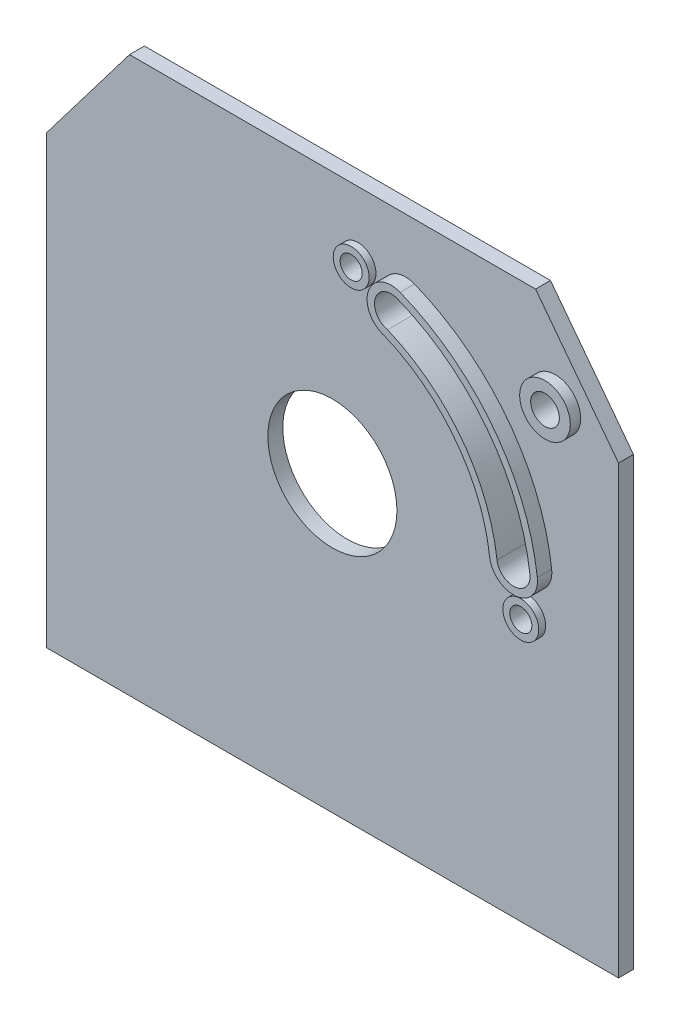
ISO-10303-21;
HEADER;
FILE_DESCRIPTION(('STEP AP214'),'2;1');
FILE_NAME('part.step','',(''),(''),'','','');
FILE_SCHEMA(('AUTOMOTIVE_DESIGN { 1 0 10303 214 1 1 1 1 }'));
ENDSEC;
DATA;
#1=APPLICATION_CONTEXT('core data for automotive mechanical design processes');
#2=APPLICATION_PROTOCOL_DEFINITION('international standard','automotive_design',2000,#1);
#3=PRODUCT_CONTEXT('',#1,'mechanical');
#4=PRODUCT('Part','Part','',(#3));
#5=PRODUCT_RELATED_PRODUCT_CATEGORY('part','',(#4));
#6=PRODUCT_DEFINITION_FORMATION('','',#4);
#7=PRODUCT_DEFINITION_CONTEXT('part definition',#1,'design');
#8=PRODUCT_DEFINITION('design','',#6,#7);
#9=PRODUCT_DEFINITION_SHAPE('','',#8);
#10=(LENGTH_UNIT() NAMED_UNIT(*) SI_UNIT(.MILLI.,.METRE.));
#11=(NAMED_UNIT(*) PLANE_ANGLE_UNIT() SI_UNIT($,.RADIAN.));
#12=(NAMED_UNIT(*) SI_UNIT($,.STERADIAN.) SOLID_ANGLE_UNIT());
#13=UNCERTAINTY_MEASURE_WITH_UNIT(LENGTH_MEASURE(1.E-05),#10,'distance_accuracy_value','');
#14=(GEOMETRIC_REPRESENTATION_CONTEXT(3) GLOBAL_UNCERTAINTY_ASSIGNED_CONTEXT((#13)) GLOBAL_UNIT_ASSIGNED_CONTEXT((#10,
#11,#12)) REPRESENTATION_CONTEXT('',''));
#15=CARTESIAN_POINT('',(0.,0.,0.));
#16=DIRECTION('',(0.,0.,1.));
#17=DIRECTION('',(1.,0.,0.));
#18=AXIS2_PLACEMENT_3D('',#15,#16,#17);
#19=CARTESIAN_POINT('',(-4.53865850270509,103.090232189093,3.302));
#20=DIRECTION('',(0.,0.,-1.));
#21=DIRECTION('',(-1.,0.,0.));
#22=AXIS2_PLACEMENT_3D('',#19,#20,#21);
#23=PLANE('',#22);
#24=CARTESIAN_POINT('',(101.914361119273,39.6877037000921,3.302));
#25=DIRECTION('',(0.,0.,-1.));
#26=DIRECTION('',(-1.,0.,0.));
#27=AXIS2_PLACEMENT_3D('',#24,#25,#26);
#28=CIRCLE('',#27,3.9699438135045);
#29=CARTESIAN_POINT('',(97.9444173057683,39.6877037000921,3.302));
#30=VERTEX_POINT('',#29);
#31=EDGE_CURVE('E39',#30,#30,#28,.F.);
#32=ORIENTED_EDGE('',*,*,#31,.F.);
#33=EDGE_LOOP('',(#32));
#34=FACE_BOUND('',#33,.T.);
#35=CARTESIAN_POINT('',(101.948212365503,50.5338067103253,3.302));
#36=DIRECTION('',(0.,0.,1.));
#37=DIRECTION('',(1.,0.,0.));
#38=AXIS2_PLACEMENT_3D('',#35,#36,#37);
#39=CIRCLE('',#38,5.31484677941774);
#40=CARTESIAN_POINT('',(96.6726249980341,49.8889996987221,3.302));
#41=VERTEX_POINT('',#40);
#42=CARTESIAN_POINT('',(107.223783387203,51.1787464933555,3.302));
#43=VERTEX_POINT('',#42);
#44=EDGE_CURVE('E162',#41,#43,#39,.T.);
#45=ORIENTED_EDGE('',*,*,#44,.F.);
#46=CARTESIAN_POINT('',(58.7102499448752,45.2839103709194,3.302));
#47=DIRECTION('',(0.,0.,-1.));
#48=DIRECTION('',(1.,0.,0.));
#49=AXIS2_PLACEMENT_3D('',#46,#47,#48);
#50=CIRCLE('',#49,38.2406690238775);
#51=CARTESIAN_POINT('',(73.552104790075,80.5268970795932,3.302));
#52=VERTEX_POINT('',#51);
#53=EDGE_CURVE('E167',#52,#41,#50,.T.);
#54=ORIENTED_EDGE('',*,*,#53,.F.);
#55=CARTESIAN_POINT('',(74.8906557668307,85.6959061029263,3.302));
#56=DIRECTION('',(0.,0.,1.));
#57=DIRECTION('',(1.,0.,0.));
#58=AXIS2_PLACEMENT_3D('',#55,#56,#57);
#59=CIRCLE('',#58,5.33951065483602);
#60=CARTESIAN_POINT('',(76.8713576571716,90.6544536780441,3.302));
#61=VERTEX_POINT('',#60);
#62=EDGE_CURVE('E51',#61,#52,#59,.T.);
#63=ORIENTED_EDGE('',*,*,#62,.F.);
#64=CARTESIAN_POINT('',(58.7102499448752,45.2839103709194,3.302));
#65=DIRECTION('',(0.,0.,1.));
#66=DIRECTION('',(1.,0.,0.));
#67=AXIS2_PLACEMENT_3D('',#64,#65,#66);
#68=CIRCLE('',#67,48.8703593190208);
#69=EDGE_CURVE('E46',#43,#61,#68,.T.);
#70=ORIENTED_EDGE('',*,*,#69,.F.);
#71=EDGE_LOOP('',(#45,#54,#63,#70));
#72=FACE_BOUND('',#71,.T.);
#73=CARTESIAN_POINT('',(58.7102499448752,45.2839103709194,3.302));
#74=DIRECTION('',(0.,0.,1.));
#75=DIRECTION('',(1.,0.,0.));
#76=AXIS2_PLACEMENT_3D('',#73,#74,#75);
#77=CIRCLE('',#76,14.2801546214257);
#78=CARTESIAN_POINT('',(72.9904045663009,45.2839103709194,3.302));
#79=VERTEX_POINT('',#78);
#80=EDGE_CURVE('E209',#79,#79,#77,.T.);
#81=ORIENTED_EDGE('',*,*,#80,.F.);
#82=EDGE_LOOP('',(#81));
#83=FACE_BOUND('',#82,.T.);
#84=DIRECTION('',(0.,-1.,0.));
#85=VECTOR('',#84,1.);
#86=CARTESIAN_POINT('',(-4.5386585027051,-19.7472607340086,3.302));
#87=LINE('',#86,#85);
#88=CARTESIAN_POINT('',(-4.5386585027051,78.9321762768436,3.302));
#89=VERTEX_POINT('',#88);
#90=CARTESIAN_POINT('',(-4.5386585027051,-19.7472607340086,3.302));
#91=VERTEX_POINT('',#90);
#92=EDGE_CURVE('E218',#89,#91,#87,.T.);
#93=ORIENTED_EDGE('',*,*,#92,.T.);
#94=DIRECTION('',(1.,0.,0.));
#95=VECTOR('',#94,1.);
#96=CARTESIAN_POINT('',(-4.5386585027051,-19.7472607340086,3.302));
#97=LINE('',#96,#95);
#98=CARTESIAN_POINT('',(122.018241697402,-19.7472607340086,3.302));
#99=VERTEX_POINT('',#98);
#100=EDGE_CURVE('E221',#91,#99,#97,.T.);
#101=ORIENTED_EDGE('',*,*,#100,.T.);
#102=DIRECTION('',(0.,1.,0.));
#103=VECTOR('',#102,1.);
#104=CARTESIAN_POINT('',(122.018241697402,-19.7472607340086,3.302));
#105=LINE('',#104,#103);
#106=CARTESIAN_POINT('',(122.018241697402,78.9321762768436,3.302));
#107=VERTEX_POINT('',#106);
#108=EDGE_CURVE('E224',#99,#107,#105,.T.);
#109=ORIENTED_EDGE('',*,*,#108,.T.);
#110=DIRECTION('',(-0.604936983131272,0.796273349070553,0.));
#111=VECTOR('',#110,1.);
#112=CARTESIAN_POINT('',(122.018241697402,78.9321762768436,3.302));
#113=LINE('',#112,#111);
#114=CARTESIAN_POINT('',(103.665120273797,103.090232189093,3.302));
#115=VERTEX_POINT('',#114);
#116=EDGE_CURVE('E226',#107,#115,#113,.T.);
#117=ORIENTED_EDGE('',*,*,#116,.T.);
#118=DIRECTION('',(-1.,0.,0.));
#119=VECTOR('',#118,1.);
#120=CARTESIAN_POINT('',(13.8144629209003,103.090232189093,3.302));
#121=LINE('',#120,#119);
#122=CARTESIAN_POINT('',(13.8144629209003,103.090232189093,3.302));
#123=VERTEX_POINT('',#122);
#124=EDGE_CURVE('E228',#115,#123,#121,.T.);
#125=ORIENTED_EDGE('',*,*,#124,.T.);
#126=DIRECTION('',(-0.604936983131272,-0.796273349070553,0.));
#127=VECTOR('',#126,1.);
#128=CARTESIAN_POINT('',(-4.5386585027051,78.9321762768436,3.302));
#129=LINE('',#128,#127);
#130=EDGE_CURVE('E230',#123,#89,#129,.T.);
#131=ORIENTED_EDGE('',*,*,#130,.T.);
#132=EDGE_LOOP('',(#93,#101,#109,#117,#125,#131));
#133=FACE_BOUND('',#132,.T.);
#134=CARTESIAN_POINT('',(64.386022104351,88.408658992849,3.302));
#135=DIRECTION('',(0.,0.,-1.));
#136=DIRECTION('',(-1.,0.,0.));
#137=AXIS2_PLACEMENT_3D('',#134,#135,#136);
#138=CIRCLE('',#137,3.96994381350452);
#139=CARTESIAN_POINT('',(60.4160782908465,88.408658992849,3.302));
#140=VERTEX_POINT('',#139);
#141=EDGE_CURVE('E261',#140,#140,#138,.F.);
#142=ORIENTED_EDGE('',*,*,#141,.F.);
#143=EDGE_LOOP('',(#142));
#144=FACE_BOUND('',#143,.T.);
#145=CARTESIAN_POINT('',(108.031447678437,83.2745987317091,3.302));
#146=DIRECTION('',(0.,0.,-1.));
#147=DIRECTION('',(-1.,0.,0.));
#148=AXIS2_PLACEMENT_3D('',#145,#146,#147);
#149=CIRCLE('',#148,5.6045816291887);
#150=CARTESIAN_POINT('',(102.426866049248,83.2745987317091,3.302));
#151=VERTEX_POINT('',#150);
#152=EDGE_CURVE('E11',#151,#151,#149,.F.);
#153=ORIENTED_EDGE('',*,*,#152,.F.);
#154=EDGE_LOOP('',(#153));
#155=FACE_BOUND('',#154,.T.);
#156=ADVANCED_FACE('F31',(#34,#72,#83,#133,#144,#155),#23,.F.);
#157=CARTESIAN_POINT('',(-4.53865850270509,103.090232189093,0.));
#158=DIRECTION('',(0.,0.,-1.));
#159=DIRECTION('',(-1.,0.,0.));
#160=AXIS2_PLACEMENT_3D('',#157,#158,#159);
#161=PLANE('',#160);
#162=CARTESIAN_POINT('',(64.386022104351,88.408658992849,0.));
#163=DIRECTION('',(0.,0.,1.));
#164=DIRECTION('',(1.,0.,0.));
#165=AXIS2_PLACEMENT_3D('',#162,#163,#164);
#166=CIRCLE('',#165,2.44594381350452);
#167=CARTESIAN_POINT('',(66.8319659178556,88.408658992849,0.));
#168=VERTEX_POINT('',#167);
#169=EDGE_CURVE('E193',#168,#168,#166,.T.);
#170=ORIENTED_EDGE('',*,*,#169,.T.);
#171=EDGE_LOOP('',(#170));
#172=FACE_BOUND('',#171,.T.);
#173=CARTESIAN_POINT('',(58.7102499448752,45.2839103709194,0.));
#174=DIRECTION('',(0.,0.,1.));
#175=DIRECTION('',(1.,0.,0.));
#176=AXIS2_PLACEMENT_3D('',#173,#174,#175);
#177=CIRCLE('',#176,14.2801546214257);
#178=CARTESIAN_POINT('',(72.9904045663009,45.2839103709194,0.));
#179=VERTEX_POINT('',#178);
#180=EDGE_CURVE('E140',#179,#179,#177,.T.);
#181=ORIENTED_EDGE('',*,*,#180,.T.);
#182=EDGE_LOOP('',(#181));
#183=FACE_BOUND('',#182,.T.);
#184=DIRECTION('',(0.,-1.,0.));
#185=VECTOR('',#184,1.);
#186=CARTESIAN_POINT('',(-4.5386585027051,-19.7472607340086,0.));
#187=LINE('',#186,#185);
#188=CARTESIAN_POINT('',(-4.5386585027051,78.9321762768436,0.));
#189=VERTEX_POINT('',#188);
#190=CARTESIAN_POINT('',(-4.5386585027051,-19.7472607340086,0.));
#191=VERTEX_POINT('',#190);
#192=EDGE_CURVE('E217',#189,#191,#187,.T.);
#193=ORIENTED_EDGE('',*,*,#192,.F.);
#194=DIRECTION('',(-0.604936983131272,-0.796273349070553,0.));
#195=VECTOR('',#194,1.);
#196=CARTESIAN_POINT('',(-4.5386585027051,78.9321762768436,0.));
#197=LINE('',#196,#195);
#198=CARTESIAN_POINT('',(13.8144629209003,103.090232189093,0.));
#199=VERTEX_POINT('',#198);
#200=EDGE_CURVE('E222',#199,#189,#197,.T.);
#201=ORIENTED_EDGE('',*,*,#200,.F.);
#202=DIRECTION('',(-1.,0.,0.));
#203=VECTOR('',#202,1.);
#204=CARTESIAN_POINT('',(13.8144629209003,103.090232189093,0.));
#205=LINE('',#204,#203);
#206=CARTESIAN_POINT('',(103.665120273797,103.090232189093,0.));
#207=VERTEX_POINT('',#206);
#208=EDGE_CURVE('E241',#207,#199,#205,.T.);
#209=ORIENTED_EDGE('',*,*,#208,.F.);
#210=DIRECTION('',(-0.604936983131272,0.796273349070553,0.));
#211=VECTOR('',#210,1.);
#212=CARTESIAN_POINT('',(122.018241697402,78.9321762768436,0.));
#213=LINE('',#212,#211);
#214=CARTESIAN_POINT('',(122.018241697402,78.9321762768436,0.));
#215=VERTEX_POINT('',#214);
#216=EDGE_CURVE('E239',#215,#207,#213,.T.);
#217=ORIENTED_EDGE('',*,*,#216,.F.);
#218=DIRECTION('',(0.,1.,0.));
#219=VECTOR('',#218,1.);
#220=CARTESIAN_POINT('',(122.018241697402,-19.7472607340086,0.));
#221=LINE('',#220,#219);
#222=CARTESIAN_POINT('',(122.018241697402,-19.7472607340086,0.));
#223=VERTEX_POINT('',#222);
#224=EDGE_CURVE('E237',#223,#215,#221,.T.);
#225=ORIENTED_EDGE('',*,*,#224,.F.);
#226=DIRECTION('',(1.,0.,0.));
#227=VECTOR('',#226,1.);
#228=CARTESIAN_POINT('',(-4.5386585027051,-19.7472607340086,0.));
#229=LINE('',#228,#227);
#230=EDGE_CURVE('E235',#191,#223,#229,.T.);
#231=ORIENTED_EDGE('',*,*,#230,.F.);
#232=EDGE_LOOP('',(#193,#201,#209,#217,#225,#231));
#233=FACE_BOUND('',#232,.T.);
#234=CARTESIAN_POINT('',(108.031447678437,83.2745987317091,0.));
#235=DIRECTION('',(0.,0.,1.));
#236=DIRECTION('',(1.,0.,0.));
#237=AXIS2_PLACEMENT_3D('',#234,#235,#236);
#238=CIRCLE('',#237,3.175);
#239=CARTESIAN_POINT('',(111.206447678437,83.2745987317091,0.));
#240=VERTEX_POINT('',#239);
#241=EDGE_CURVE('E212',#240,#240,#238,.T.);
#242=ORIENTED_EDGE('',*,*,#241,.T.);
#243=EDGE_LOOP('',(#242));
#244=FACE_BOUND('',#243,.T.);
#245=CARTESIAN_POINT('',(74.8906557668307,85.6959061029263,0.));
#246=DIRECTION('',(0.,0.,1.));
#247=DIRECTION('',(1.,0.,0.));
#248=AXIS2_PLACEMENT_3D('',#245,#246,#247);
#249=CIRCLE('',#248,3.68851078564109);
#250=CARTESIAN_POINT('',(76.2584574883382,89.1214323787606,0.));
#251=VERTEX_POINT('',#250);
#252=CARTESIAN_POINT('',(74.070723533951,82.0996826742061,0.));
#253=VERTEX_POINT('',#252);
#254=EDGE_CURVE('E202',#251,#253,#249,.T.);
#255=ORIENTED_EDGE('',*,*,#254,.T.);
#256=CARTESIAN_POINT('',(58.7102499448752,45.2839103709194,0.));
#257=DIRECTION('',(0.,0.,-1.));
#258=DIRECTION('',(1.,0.,0.));
#259=AXIS2_PLACEMENT_3D('',#256,#257,#258);
#260=CIRCLE('',#259,39.8916687939744);
#261=CARTESIAN_POINT('',(98.31150142406,50.0887121827027,0.));
#262=VERTEX_POINT('',#261);
#263=EDGE_CURVE('E196',#253,#262,#260,.T.);
#264=ORIENTED_EDGE('',*,*,#263,.T.);
#265=CARTESIAN_POINT('',(101.948212365503,50.5338067103253,0.));
#266=DIRECTION('',(0.,0.,1.));
#267=DIRECTION('',(1.,0.,0.));
#268=AXIS2_PLACEMENT_3D('',#265,#266,#267);
#269=CIRCLE('',#268,3.66384710517959);
#270=CARTESIAN_POINT('',(105.584923306947,50.9789012379478,0.));
#271=VERTEX_POINT('',#270);
#272=EDGE_CURVE('E137',#262,#271,#269,.T.);
#273=ORIENTED_EDGE('',*,*,#272,.T.);
#274=CARTESIAN_POINT('',(58.7102499448752,45.2839103709194,0.));
#275=DIRECTION('',(0.,0.,1.));
#276=DIRECTION('',(1.,0.,0.));
#277=AXIS2_PLACEMENT_3D('',#274,#275,#276);
#278=CIRCLE('',#277,47.2193596290379);
#279=EDGE_CURVE('E199',#271,#251,#278,.T.);
#280=ORIENTED_EDGE('',*,*,#279,.T.);
#281=EDGE_LOOP('',(#255,#264,#273,#280));
#282=FACE_BOUND('',#281,.T.);
#283=CARTESIAN_POINT('',(101.914361119273,39.6877037000921,0.));
#284=DIRECTION('',(0.,0.,1.));
#285=DIRECTION('',(-1.,0.,0.));
#286=AXIS2_PLACEMENT_3D('',#283,#284,#285);
#287=CIRCLE('',#286,2.44594381350451);
#288=CARTESIAN_POINT('',(99.4684173057683,39.6877037000921,0.));
#289=VERTEX_POINT('',#288);
#290=EDGE_CURVE('E190',#289,#289,#287,.T.);
#291=ORIENTED_EDGE('',*,*,#290,.T.);
#292=EDGE_LOOP('',(#291));
#293=FACE_BOUND('',#292,.T.);
#294=ADVANCED_FACE('F269',(#172,#183,#233,#244,#282,#293),#161,.T.);
#295=CARTESIAN_POINT('',(-4.5386585027051,-19.7472607340086,3.302));
#296=DIRECTION('',(1.,0.,0.));
#297=DIRECTION('',(0.,0.,-1.));
#298=AXIS2_PLACEMENT_3D('',#295,#296,#297);
#299=PLANE('',#298);
#300=ORIENTED_EDGE('',*,*,#192,.T.);
#301=DIRECTION('',(0.,0.,-1.));
#302=VECTOR('',#301,1.);
#303=CARTESIAN_POINT('',(-4.5386585027051,-19.7472607340086,3.302));
#304=LINE('',#303,#302);
#305=EDGE_CURVE('E258',#91,#191,#304,.T.);
#306=ORIENTED_EDGE('',*,*,#305,.F.);
#307=ORIENTED_EDGE('',*,*,#92,.F.);
#308=DIRECTION('',(0.,0.,-1.));
#309=VECTOR('',#308,1.);
#310=CARTESIAN_POINT('',(-4.5386585027051,78.9321762768436,3.302));
#311=LINE('',#310,#309);
#312=EDGE_CURVE('E232',#89,#189,#311,.T.);
#313=ORIENTED_EDGE('',*,*,#312,.T.);
#314=EDGE_LOOP('',(#300,#306,#307,#313));
#315=FACE_BOUND('',#314,.T.);
#316=ADVANCED_FACE('F33',(#315),#299,.F.);
#317=CARTESIAN_POINT('',(-4.5386585027051,-19.7472607340086,3.302));
#318=DIRECTION('',(0.,1.,0.));
#319=DIRECTION('',(0.,0.,1.));
#320=AXIS2_PLACEMENT_3D('',#317,#318,#319);
#321=PLANE('',#320);
#322=ORIENTED_EDGE('',*,*,#230,.T.);
#323=DIRECTION('',(0.,0.,-1.));
#324=VECTOR('',#323,1.);
#325=CARTESIAN_POINT('',(122.018241697402,-19.7472607340086,3.302));
#326=LINE('',#325,#324);
#327=EDGE_CURVE('E255',#99,#223,#326,.T.);
#328=ORIENTED_EDGE('',*,*,#327,.F.);
#329=ORIENTED_EDGE('',*,*,#100,.F.);
#330=ORIENTED_EDGE('',*,*,#305,.T.);
#331=EDGE_LOOP('',(#322,#328,#329,#330));
#332=FACE_BOUND('',#331,.T.);
#333=ADVANCED_FACE('F372',(#332),#321,.F.);
#334=CARTESIAN_POINT('',(122.018241697402,-19.7472607340086,3.302));
#335=DIRECTION('',(-1.,0.,0.));
#336=DIRECTION('',(0.,0.,1.));
#337=AXIS2_PLACEMENT_3D('',#334,#335,#336);
#338=PLANE('',#337);
#339=ORIENTED_EDGE('',*,*,#224,.T.);
#340=DIRECTION('',(0.,0.,-1.));
#341=VECTOR('',#340,1.);
#342=CARTESIAN_POINT('',(122.018241697402,78.9321762768436,3.302));
#343=LINE('',#342,#341);
#344=EDGE_CURVE('E252',#107,#215,#343,.T.);
#345=ORIENTED_EDGE('',*,*,#344,.F.);
#346=ORIENTED_EDGE('',*,*,#108,.F.);
#347=ORIENTED_EDGE('',*,*,#327,.T.);
#348=EDGE_LOOP('',(#339,#345,#346,#347));
#349=FACE_BOUND('',#348,.T.);
#350=ADVANCED_FACE('F369',(#349),#338,.F.);
#351=CARTESIAN_POINT('',(122.018241697402,78.9321762768436,3.302));
#352=DIRECTION('',(-0.796273349070553,-0.604936983131273,0.));
#353=DIRECTION('',(0.604936983131273,-0.796273349070553,0.));
#354=AXIS2_PLACEMENT_3D('',#351,#352,#353);
#355=PLANE('',#354);
#356=ORIENTED_EDGE('',*,*,#216,.T.);
#357=DIRECTION('',(0.,0.,-1.));
#358=VECTOR('',#357,1.);
#359=CARTESIAN_POINT('',(103.665120273797,103.090232189093,3.302));
#360=LINE('',#359,#358);
#361=EDGE_CURVE('E249',#115,#207,#360,.T.);
#362=ORIENTED_EDGE('',*,*,#361,.F.);
#363=ORIENTED_EDGE('',*,*,#116,.F.);
#364=ORIENTED_EDGE('',*,*,#344,.T.);
#365=EDGE_LOOP('',(#356,#362,#363,#364));
#366=FACE_BOUND('',#365,.T.);
#367=ADVANCED_FACE('F365',(#366),#355,.F.);
#368=CARTESIAN_POINT('',(13.8144629209003,103.090232189093,3.302));
#369=DIRECTION('',(0.,-1.,0.));
#370=DIRECTION('',(0.,0.,-1.));
#371=AXIS2_PLACEMENT_3D('',#368,#369,#370);
#372=PLANE('',#371);
#373=ORIENTED_EDGE('',*,*,#208,.T.);
#374=DIRECTION('',(0.,0.,-1.));
#375=VECTOR('',#374,1.);
#376=CARTESIAN_POINT('',(13.8144629209003,103.090232189093,3.302));
#377=LINE('',#376,#375);
#378=EDGE_CURVE('E246',#123,#199,#377,.T.);
#379=ORIENTED_EDGE('',*,*,#378,.F.);
#380=ORIENTED_EDGE('',*,*,#124,.F.);
#381=ORIENTED_EDGE('',*,*,#361,.T.);
#382=EDGE_LOOP('',(#373,#379,#380,#381));
#383=FACE_BOUND('',#382,.T.);
#384=ADVANCED_FACE('F361',(#383),#372,.F.);
#385=CARTESIAN_POINT('',(-4.5386585027051,78.9321762768436,3.302));
#386=DIRECTION('',(0.796273349070553,-0.604936983131273,0.));
#387=DIRECTION('',(0.604936983131273,0.796273349070553,0.));
#388=AXIS2_PLACEMENT_3D('',#385,#386,#387);
#389=PLANE('',#388);
#390=ORIENTED_EDGE('',*,*,#200,.T.);
#391=ORIENTED_EDGE('',*,*,#312,.F.);
#392=ORIENTED_EDGE('',*,*,#130,.F.);
#393=ORIENTED_EDGE('',*,*,#378,.T.);
#394=EDGE_LOOP('',(#390,#391,#392,#393));
#395=FACE_BOUND('',#394,.T.);
#396=ADVANCED_FACE('F353',(#395),#389,.F.);
#397=CARTESIAN_POINT('',(108.031447678437,83.2745987317091,3.302));
#398=DIRECTION('',(0.,0.,-1.));
#399=DIRECTION('',(-1.,0.,0.));
#400=AXIS2_PLACEMENT_3D('',#397,#398,#399);
#401=CYLINDRICAL_SURFACE('',#400,3.175);
#402=ORIENTED_EDGE('',*,*,#241,.F.);
#403=EDGE_LOOP('',(#402));
#404=FACE_BOUND('',#403,.T.);
#405=CARTESIAN_POINT('',(108.031447678437,83.2745987317091,5.588));
#406=DIRECTION('',(0.,0.,1.));
#407=DIRECTION('',(1.,0.,0.));
#408=AXIS2_PLACEMENT_3D('',#405,#406,#407);
#409=CIRCLE('',#408,3.175);
#410=CARTESIAN_POINT('',(111.206447678437,83.2745987317091,5.588));
#411=VERTEX_POINT('',#410);
#412=EDGE_CURVE('E413',#411,#411,#409,.T.);
#413=ORIENTED_EDGE('',*,*,#412,.T.);
#414=EDGE_LOOP('',(#413));
#415=FACE_BOUND('',#414,.T.);
#416=ADVANCED_FACE('F350',(#404,#415),#401,.F.);
#417=CARTESIAN_POINT('',(58.7102499448752,45.2839103709194,3.302));
#418=DIRECTION('',(0.,0.,-1.));
#419=DIRECTION('',(-1.,0.,0.));
#420=AXIS2_PLACEMENT_3D('',#417,#418,#419);
#421=CYLINDRICAL_SURFACE('',#420,14.2801546214257);
#422=ORIENTED_EDGE('',*,*,#80,.T.);
#423=EDGE_LOOP('',(#422));
#424=FACE_BOUND('',#423,.T.);
#425=ORIENTED_EDGE('',*,*,#180,.F.);
#426=EDGE_LOOP('',(#425));
#427=FACE_BOUND('',#426,.T.);
#428=ADVANCED_FACE('F347',(#424,#427),#421,.F.);
#429=CARTESIAN_POINT('',(58.7102499448752,45.2839103709194,3.302));
#430=DIRECTION('',(0.,0.,-1.));
#431=DIRECTION('',(-1.,0.,0.));
#432=AXIS2_PLACEMENT_3D('',#429,#430,#431);
#433=CYLINDRICAL_SURFACE('',#432,39.8916687939744);
#434=ORIENTED_EDGE('',*,*,#263,.F.);
#435=DIRECTION('',(0.,0.,-1.));
#436=VECTOR('',#435,1.);
#437=CARTESIAN_POINT('',(74.070723533951,82.0996826742061,3.302));
#438=LINE('',#437,#436);
#439=CARTESIAN_POINT('',(74.070723533951,82.0996826742061,6.477));
#440=VERTEX_POINT('',#439);
#441=EDGE_CURVE('E147',#440,#253,#438,.T.);
#442=ORIENTED_EDGE('',*,*,#441,.F.);
#443=CARTESIAN_POINT('',(58.7102499448752,45.2839103709194,6.477));
#444=DIRECTION('',(0.,0.,-1.));
#445=DIRECTION('',(1.,0.,0.));
#446=AXIS2_PLACEMENT_3D('',#443,#444,#445);
#447=CIRCLE('',#446,39.8916687939744);
#448=CARTESIAN_POINT('',(98.31150142406,50.0887121827027,6.477));
#449=VERTEX_POINT('',#448);
#450=EDGE_CURVE('E144',#440,#449,#447,.T.);
#451=ORIENTED_EDGE('',*,*,#450,.T.);
#452=DIRECTION('',(0.,0.,-1.));
#453=VECTOR('',#452,1.);
#454=CARTESIAN_POINT('',(98.31150142406,50.0887121827027,3.302));
#455=LINE('',#454,#453);
#456=EDGE_CURVE('E130',#449,#262,#455,.T.);
#457=ORIENTED_EDGE('',*,*,#456,.T.);
#458=EDGE_LOOP('',(#434,#442,#451,#457));
#459=FACE_BOUND('',#458,.T.);
#460=ADVANCED_FACE('F145',(#459),#433,.T.);
#461=CARTESIAN_POINT('',(101.948212365503,50.5338067103253,3.302));
#462=DIRECTION('',(0.,0.,-1.));
#463=DIRECTION('',(-1.,0.,0.));
#464=AXIS2_PLACEMENT_3D('',#461,#462,#463);
#465=CYLINDRICAL_SURFACE('',#464,3.66384710517959);
#466=ORIENTED_EDGE('',*,*,#272,.F.);
#467=ORIENTED_EDGE('',*,*,#456,.F.);
#468=CARTESIAN_POINT('',(101.948212365503,50.5338067103253,6.477));
#469=DIRECTION('',(0.,0.,1.));
#470=DIRECTION('',(1.,0.,0.));
#471=AXIS2_PLACEMENT_3D('',#468,#469,#470);
#472=CIRCLE('',#471,3.66384710517959);
#473=CARTESIAN_POINT('',(105.584923306947,50.9789012379478,6.477));
#474=VERTEX_POINT('',#473);
#475=EDGE_CURVE('E134',#449,#474,#472,.T.);
#476=ORIENTED_EDGE('',*,*,#475,.T.);
#477=DIRECTION('',(0.,0.,-1.));
#478=VECTOR('',#477,1.);
#479=CARTESIAN_POINT('',(105.584923306947,50.9789012379478,3.302));
#480=LINE('',#479,#478);
#481=EDGE_CURVE('E141',#474,#271,#480,.T.);
#482=ORIENTED_EDGE('',*,*,#481,.T.);
#483=EDGE_LOOP('',(#466,#467,#476,#482));
#484=FACE_BOUND('',#483,.T.);
#485=ADVANCED_FACE('F132',(#484),#465,.F.);
#486=CARTESIAN_POINT('',(58.7102499448752,45.2839103709194,3.302));
#487=DIRECTION('',(0.,0.,-1.));
#488=DIRECTION('',(-1.,0.,0.));
#489=AXIS2_PLACEMENT_3D('',#486,#487,#488);
#490=CYLINDRICAL_SURFACE('',#489,47.2193596290379);
#491=ORIENTED_EDGE('',*,*,#279,.F.);
#492=ORIENTED_EDGE('',*,*,#481,.F.);
#493=CARTESIAN_POINT('',(58.7102499448752,45.2839103709194,6.477));
#494=DIRECTION('',(0.,0.,1.));
#495=DIRECTION('',(1.,0.,0.));
#496=AXIS2_PLACEMENT_3D('',#493,#494,#495);
#497=CIRCLE('',#496,47.2193596290379);
#498=CARTESIAN_POINT('',(76.2584574883382,89.1214323787606,6.477));
#499=VERTEX_POINT('',#498);
#500=EDGE_CURVE('E155',#474,#499,#497,.T.);
#501=ORIENTED_EDGE('',*,*,#500,.T.);
#502=DIRECTION('',(0.,0.,-1.));
#503=VECTOR('',#502,1.);
#504=CARTESIAN_POINT('',(76.2584574883382,89.1214323787606,3.302));
#505=LINE('',#504,#503);
#506=EDGE_CURVE('E206',#499,#251,#505,.T.);
#507=ORIENTED_EDGE('',*,*,#506,.T.);
#508=EDGE_LOOP('',(#491,#492,#501,#507));
#509=FACE_BOUND('',#508,.T.);
#510=ADVANCED_FACE('F338',(#509),#490,.F.);
#511=CARTESIAN_POINT('',(74.8906557668307,85.6959061029263,3.302));
#512=DIRECTION('',(0.,0.,-1.));
#513=DIRECTION('',(-1.,0.,0.));
#514=AXIS2_PLACEMENT_3D('',#511,#512,#513);
#515=CYLINDRICAL_SURFACE('',#514,3.68851078564109);
#516=ORIENTED_EDGE('',*,*,#254,.F.);
#517=ORIENTED_EDGE('',*,*,#506,.F.);
#518=CARTESIAN_POINT('',(74.8906557668307,85.6959061029263,6.477));
#519=DIRECTION('',(0.,0.,1.));
#520=DIRECTION('',(1.,0.,0.));
#521=AXIS2_PLACEMENT_3D('',#518,#519,#520);
#522=CIRCLE('',#521,3.68851078564109);
#523=EDGE_CURVE('E157',#499,#440,#522,.T.);
#524=ORIENTED_EDGE('',*,*,#523,.T.);
#525=ORIENTED_EDGE('',*,*,#441,.T.);
#526=EDGE_LOOP('',(#516,#517,#524,#525));
#527=FACE_BOUND('',#526,.T.);
#528=ADVANCED_FACE('F334',(#527),#515,.F.);
#529=CARTESIAN_POINT('',(64.386022104351,88.408658992849,3.302));
#530=DIRECTION('',(0.,0.,-1.));
#531=DIRECTION('',(-1.,0.,0.));
#532=AXIS2_PLACEMENT_3D('',#529,#530,#531);
#533=CYLINDRICAL_SURFACE('',#532,2.44594381350452);
#534=ORIENTED_EDGE('',*,*,#169,.F.);
#535=EDGE_LOOP('',(#534));
#536=FACE_BOUND('',#535,.T.);
#537=CARTESIAN_POINT('',(64.386022104351,88.408658992849,4.826));
#538=DIRECTION('',(0.,0.,1.));
#539=DIRECTION('',(1.,0.,0.));
#540=AXIS2_PLACEMENT_3D('',#537,#538,#539);
#541=CIRCLE('',#540,2.44594381350452);
#542=CARTESIAN_POINT('',(66.8319659178556,88.408658992849,4.826));
#543=VERTEX_POINT('',#542);
#544=EDGE_CURVE('E410',#543,#543,#541,.T.);
#545=ORIENTED_EDGE('',*,*,#544,.T.);
#546=EDGE_LOOP('',(#545));
#547=FACE_BOUND('',#546,.T.);
#548=ADVANCED_FACE('F330',(#536,#547),#533,.F.);
#549=CARTESIAN_POINT('',(101.914361119273,39.6877037000921,3.302));
#550=DIRECTION('',(0.,0.,-1.));
#551=DIRECTION('',(-1.,0.,0.));
#552=AXIS2_PLACEMENT_3D('',#549,#550,#551);
#553=CYLINDRICAL_SURFACE('',#552,2.44594381350451);
#554=ORIENTED_EDGE('',*,*,#290,.F.);
#555=EDGE_LOOP('',(#554));
#556=FACE_BOUND('',#555,.T.);
#557=CARTESIAN_POINT('',(101.914361119273,39.6877037000921,4.826));
#558=DIRECTION('',(0.,0.,1.));
#559=DIRECTION('',(1.,0.,0.));
#560=AXIS2_PLACEMENT_3D('',#557,#558,#559);
#561=CIRCLE('',#560,2.4459438135045);
#562=CARTESIAN_POINT('',(104.360304932777,39.6877037000921,4.826));
#563=VERTEX_POINT('',#562);
#564=EDGE_CURVE('E404',#563,#563,#561,.T.);
#565=ORIENTED_EDGE('',*,*,#564,.T.);
#566=EDGE_LOOP('',(#565));
#567=FACE_BOUND('',#566,.T.);
#568=ADVANCED_FACE('F312',(#556,#567),#553,.F.);
#569=CARTESIAN_POINT('',(80.3292311551892,47.9088585406223,6.477));
#570=DIRECTION('',(0.,0.,1.));
#571=DIRECTION('',(1.,0.,0.));
#572=AXIS2_PLACEMENT_3D('',#569,#570,#571);
#573=PLANE('',#572);
#574=CARTESIAN_POINT('',(101.948212365503,50.5338067103253,6.477));
#575=DIRECTION('',(0.,0.,1.));
#576=DIRECTION('',(1.,0.,0.));
#577=AXIS2_PLACEMENT_3D('',#574,#575,#576);
#578=CIRCLE('',#577,5.31484677941774);
#579=CARTESIAN_POINT('',(96.6726249980341,49.8889996987221,6.477));
#580=VERTEX_POINT('',#579);
#581=CARTESIAN_POINT('',(107.223783387203,51.1787464933555,6.477));
#582=VERTEX_POINT('',#581);
#583=EDGE_CURVE('E163',#580,#582,#578,.T.);
#584=ORIENTED_EDGE('',*,*,#583,.T.);
#585=CARTESIAN_POINT('',(58.7102499448752,45.2839103709194,6.477));
#586=DIRECTION('',(0.,0.,1.));
#587=DIRECTION('',(1.,0.,0.));
#588=AXIS2_PLACEMENT_3D('',#585,#586,#587);
#589=CIRCLE('',#588,48.8703593190208);
#590=CARTESIAN_POINT('',(76.8713576571716,90.6544536780441,6.477));
#591=VERTEX_POINT('',#590);
#592=EDGE_CURVE('E166',#582,#591,#589,.T.);
#593=ORIENTED_EDGE('',*,*,#592,.T.);
#594=CARTESIAN_POINT('',(74.8906557668307,85.6959061029263,6.477));
#595=DIRECTION('',(0.,0.,1.));
#596=DIRECTION('',(1.,0.,0.));
#597=AXIS2_PLACEMENT_3D('',#594,#595,#596);
#598=CIRCLE('',#597,5.33951065483602);
#599=CARTESIAN_POINT('',(73.552104790075,80.5268970795932,6.477));
#600=VERTEX_POINT('',#599);
#601=EDGE_CURVE('E169',#591,#600,#598,.T.);
#602=ORIENTED_EDGE('',*,*,#601,.T.);
#603=CARTESIAN_POINT('',(58.7102499448752,45.2839103709194,6.477));
#604=DIRECTION('',(0.,0.,-1.));
#605=DIRECTION('',(1.,0.,0.));
#606=AXIS2_PLACEMENT_3D('',#603,#604,#605);
#607=CIRCLE('',#606,38.2406690238775);
#608=EDGE_CURVE('E171',#600,#580,#607,.T.);
#609=ORIENTED_EDGE('',*,*,#608,.T.);
#610=EDGE_LOOP('',(#584,#593,#602,#609));
#611=FACE_BOUND('',#610,.T.);
#612=ORIENTED_EDGE('',*,*,#475,.F.);
#613=ORIENTED_EDGE('',*,*,#450,.F.);
#614=ORIENTED_EDGE('',*,*,#523,.F.);
#615=ORIENTED_EDGE('',*,*,#500,.F.);
#616=EDGE_LOOP('',(#612,#613,#614,#615));
#617=FACE_BOUND('',#616,.T.);
#618=ADVANCED_FACE('F153',(#611,#617),#573,.T.);
#619=CARTESIAN_POINT('',(101.948212365503,50.5338067103253,6.477));
#620=DIRECTION('',(0.,0.,-1.));
#621=DIRECTION('',(-1.,0.,0.));
#622=AXIS2_PLACEMENT_3D('',#619,#620,#621);
#623=CYLINDRICAL_SURFACE('',#622,5.31484677941774);
#624=ORIENTED_EDGE('',*,*,#44,.T.);
#625=DIRECTION('',(0.,0.,-1.));
#626=VECTOR('',#625,1.);
#627=CARTESIAN_POINT('',(107.223783387203,51.1787464933555,6.477));
#628=LINE('',#627,#626);
#629=EDGE_CURVE('E188',#582,#43,#628,.T.);
#630=ORIENTED_EDGE('',*,*,#629,.F.);
#631=ORIENTED_EDGE('',*,*,#583,.F.);
#632=DIRECTION('',(0.,0.,-1.));
#633=VECTOR('',#632,1.);
#634=CARTESIAN_POINT('',(96.6726249980341,49.8889996987221,6.477));
#635=LINE('',#634,#633);
#636=EDGE_CURVE('E173',#580,#41,#635,.T.);
#637=ORIENTED_EDGE('',*,*,#636,.T.);
#638=EDGE_LOOP('',(#624,#630,#631,#637));
#639=FACE_BOUND('',#638,.T.);
#640=ADVANCED_FACE('F311',(#639),#623,.T.);
#641=CARTESIAN_POINT('',(58.7102499448752,45.2839103709194,6.477));
#642=DIRECTION('',(0.,0.,-1.));
#643=DIRECTION('',(-1.,0.,0.));
#644=AXIS2_PLACEMENT_3D('',#641,#642,#643);
#645=CYLINDRICAL_SURFACE('',#644,48.8703593190208);
#646=ORIENTED_EDGE('',*,*,#69,.T.);
#647=DIRECTION('',(0.,0.,-1.));
#648=VECTOR('',#647,1.);
#649=CARTESIAN_POINT('',(76.8713576571716,90.6544536780441,6.477));
#650=LINE('',#649,#648);
#651=EDGE_CURVE('E185',#591,#61,#650,.T.);
#652=ORIENTED_EDGE('',*,*,#651,.F.);
#653=ORIENTED_EDGE('',*,*,#592,.F.);
#654=ORIENTED_EDGE('',*,*,#629,.T.);
#655=EDGE_LOOP('',(#646,#652,#653,#654));
#656=FACE_BOUND('',#655,.T.);
#657=ADVANCED_FACE('F320',(#656),#645,.T.);
#658=CARTESIAN_POINT('',(74.8906557668307,85.6959061029263,6.477));
#659=DIRECTION('',(0.,0.,-1.));
#660=DIRECTION('',(-1.,0.,0.));
#661=AXIS2_PLACEMENT_3D('',#658,#659,#660);
#662=CYLINDRICAL_SURFACE('',#661,5.33951065483602);
#663=ORIENTED_EDGE('',*,*,#62,.T.);
#664=DIRECTION('',(0.,0.,-1.));
#665=VECTOR('',#664,1.);
#666=CARTESIAN_POINT('',(73.552104790075,80.5268970795932,6.477));
#667=LINE('',#666,#665);
#668=EDGE_CURVE('E182',#600,#52,#667,.T.);
#669=ORIENTED_EDGE('',*,*,#668,.F.);
#670=ORIENTED_EDGE('',*,*,#601,.F.);
#671=ORIENTED_EDGE('',*,*,#651,.T.);
#672=EDGE_LOOP('',(#663,#669,#670,#671));
#673=FACE_BOUND('',#672,.T.);
#674=ADVANCED_FACE('F316',(#673),#662,.T.);
#675=CARTESIAN_POINT('',(58.7102499448752,45.2839103709194,6.477));
#676=DIRECTION('',(0.,0.,-1.));
#677=DIRECTION('',(-1.,0.,0.));
#678=AXIS2_PLACEMENT_3D('',#675,#676,#677);
#679=CYLINDRICAL_SURFACE('',#678,38.2406690238775);
#680=ORIENTED_EDGE('',*,*,#53,.T.);
#681=ORIENTED_EDGE('',*,*,#636,.F.);
#682=ORIENTED_EDGE('',*,*,#608,.F.);
#683=ORIENTED_EDGE('',*,*,#668,.T.);
#684=EDGE_LOOP('',(#680,#681,#682,#683));
#685=FACE_BOUND('',#684,.T.);
#686=ADVANCED_FACE('F304',(#685),#679,.F.);
#687=CARTESIAN_POINT('',(64.386022104351,88.408658992849,4.826));
#688=DIRECTION('',(0.,0.,1.));
#689=DIRECTION('',(1.,0.,0.));
#690=AXIS2_PLACEMENT_3D('',#687,#688,#689);
#691=PLANE('',#690);
#692=CARTESIAN_POINT('',(64.386022104351,88.408658992849,4.826));
#693=DIRECTION('',(0.,0.,1.));
#694=DIRECTION('',(1.,0.,0.));
#695=AXIS2_PLACEMENT_3D('',#692,#693,#694);
#696=CIRCLE('',#695,3.96994381350452);
#697=CARTESIAN_POINT('',(60.4160782908465,88.408658992849,4.826));
#698=VERTEX_POINT('',#697);
#699=EDGE_CURVE('E151',#698,#698,#696,.T.);
#700=ORIENTED_EDGE('',*,*,#699,.T.);
#701=EDGE_LOOP('',(#700));
#702=FACE_BOUND('',#701,.T.);
#703=ORIENTED_EDGE('',*,*,#544,.F.);
#704=EDGE_LOOP('',(#703));
#705=FACE_BOUND('',#704,.T.);
#706=ADVANCED_FACE('F301',(#702,#705),#691,.T.);
#707=CARTESIAN_POINT('',(64.386022104351,88.408658992849,4.826));
#708=DIRECTION('',(0.,0.,-1.));
#709=DIRECTION('',(-1.,0.,0.));
#710=AXIS2_PLACEMENT_3D('',#707,#708,#709);
#711=CYLINDRICAL_SURFACE('',#710,3.96994381350452);
#712=CARTESIAN_POINT('',(60.4160782908465,88.408658992849,4.826));
#713=CARTESIAN_POINT('',(60.4160782908465,88.408658992849,4.810125));
#714=CARTESIAN_POINT('',(60.4160782908465,88.408658992849,4.79425));
#715=CARTESIAN_POINT('',(60.4160782908465,88.408658992849,4.7625));
#716=CARTESIAN_POINT('',(60.4160782908465,88.408658992849,4.746625));
#717=CARTESIAN_POINT('',(60.4160782908465,88.408658992849,4.714875));
#718=CARTESIAN_POINT('',(60.4160782908465,88.408658992849,4.699));
#719=CARTESIAN_POINT('',(60.4160782908465,88.408658992849,4.66725));
#720=CARTESIAN_POINT('',(60.4160782908465,88.408658992849,4.651375));
#721=CARTESIAN_POINT('',(60.4160782908465,88.408658992849,4.619625));
#722=CARTESIAN_POINT('',(60.4160782908465,88.408658992849,4.60375));
#723=CARTESIAN_POINT('',(60.4160782908465,88.408658992849,4.572));
#724=CARTESIAN_POINT('',(60.4160782908465,88.408658992849,4.556125));
#725=CARTESIAN_POINT('',(60.4160782908465,88.408658992849,4.524375));
#726=CARTESIAN_POINT('',(60.4160782908465,88.408658992849,4.5085));
#727=CARTESIAN_POINT('',(60.4160782908465,88.408658992849,4.47675));
#728=CARTESIAN_POINT('',(60.4160782908465,88.408658992849,4.460875));
#729=CARTESIAN_POINT('',(60.4160782908465,88.408658992849,4.429125));
#730=CARTESIAN_POINT('',(60.4160782908465,88.408658992849,4.41325));
#731=CARTESIAN_POINT('',(60.4160782908465,88.408658992849,4.3815));
#732=CARTESIAN_POINT('',(60.4160782908465,88.408658992849,4.365625));
#733=CARTESIAN_POINT('',(60.4160782908465,88.408658992849,4.333875));
#734=CARTESIAN_POINT('',(60.4160782908465,88.408658992849,4.318));
#735=CARTESIAN_POINT('',(60.4160782908465,88.408658992849,4.28625));
#736=CARTESIAN_POINT('',(60.4160782908465,88.408658992849,4.270375));
#737=CARTESIAN_POINT('',(60.4160782908465,88.408658992849,4.238625));
#738=CARTESIAN_POINT('',(60.4160782908465,88.408658992849,4.22275));
#739=CARTESIAN_POINT('',(60.4160782908465,88.408658992849,4.191));
#740=CARTESIAN_POINT('',(60.4160782908465,88.408658992849,4.175125));
#741=CARTESIAN_POINT('',(60.4160782908465,88.408658992849,4.143375));
#742=CARTESIAN_POINT('',(60.4160782908465,88.408658992849,4.1275));
#743=CARTESIAN_POINT('',(60.4160782908465,88.408658992849,4.09575));
#744=CARTESIAN_POINT('',(60.4160782908465,88.408658992849,4.079875));
#745=CARTESIAN_POINT('',(60.4160782908465,88.408658992849,4.048125));
#746=CARTESIAN_POINT('',(60.4160782908465,88.408658992849,4.03225));
#747=CARTESIAN_POINT('',(60.4160782908465,88.408658992849,4.0005));
#748=CARTESIAN_POINT('',(60.4160782908465,88.408658992849,3.984625));
#749=CARTESIAN_POINT('',(60.4160782908465,88.408658992849,3.952875));
#750=CARTESIAN_POINT('',(60.4160782908465,88.408658992849,3.937));
#751=CARTESIAN_POINT('',(60.4160782908465,88.408658992849,3.90525));
#752=CARTESIAN_POINT('',(60.4160782908465,88.408658992849,3.889375));
#753=CARTESIAN_POINT('',(60.4160782908465,88.408658992849,3.857625));
#754=CARTESIAN_POINT('',(60.4160782908465,88.408658992849,3.84175));
#755=CARTESIAN_POINT('',(60.4160782908465,88.408658992849,3.81));
#756=CARTESIAN_POINT('',(60.4160782908465,88.408658992849,3.794125));
#757=CARTESIAN_POINT('',(60.4160782908465,88.408658992849,3.762375));
#758=CARTESIAN_POINT('',(60.4160782908465,88.408658992849,3.7465));
#759=CARTESIAN_POINT('',(60.4160782908465,88.408658992849,3.71475));
#760=CARTESIAN_POINT('',(60.4160782908465,88.408658992849,3.698875));
#761=CARTESIAN_POINT('',(60.4160782908465,88.408658992849,3.667125));
#762=CARTESIAN_POINT('',(60.4160782908465,88.408658992849,3.65125));
#763=CARTESIAN_POINT('',(60.4160782908465,88.408658992849,3.6195));
#764=CARTESIAN_POINT('',(60.4160782908465,88.408658992849,3.603625));
#765=CARTESIAN_POINT('',(60.4160782908465,88.408658992849,3.571875));
#766=CARTESIAN_POINT('',(60.4160782908465,88.408658992849,3.556));
#767=CARTESIAN_POINT('',(60.4160782908465,88.408658992849,3.52425));
#768=CARTESIAN_POINT('',(60.4160782908465,88.408658992849,3.508375));
#769=CARTESIAN_POINT('',(60.4160782908465,88.408658992849,3.476625));
#770=CARTESIAN_POINT('',(60.4160782908465,88.408658992849,3.46075));
#771=CARTESIAN_POINT('',(60.4160782908465,88.408658992849,3.429));
#772=CARTESIAN_POINT('',(60.4160782908465,88.408658992849,3.413125));
#773=CARTESIAN_POINT('',(60.4160782908465,88.408658992849,3.381375));
#774=CARTESIAN_POINT('',(60.4160782908465,88.408658992849,3.3655));
#775=CARTESIAN_POINT('',(60.4160782908465,88.408658992849,3.33375));
#776=CARTESIAN_POINT('',(60.4160782908465,88.408658992849,3.317875));
#777=CARTESIAN_POINT('',(60.4160782908465,88.408658992849,3.302));
#778=B_SPLINE_CURVE_WITH_KNOTS('',3,(#712,#713,#714,#715,#716,#717,#718,#719,#720,#721,#722,
#723,#724,#725,#726,#727,#728,#729,#730,#731,#732,#733,#734,#735,#736,#737,#738,#739,#740,#741,
#742,#743,#744,#745,#746,#747,#748,#749,#750,#751,#752,#753,#754,#755,#756,#757,#758,#759,#760,
#761,#762,#763,#764,#765,#766,#767,#768,#769,#770,#771,#772,#773,#774,#775,#776,#777),
.UNSPECIFIED.,.F.,.F.,(4,2,2,2,2,2,2,2,2,2,2,2,2,2,2,2,2,2,2,2,2,2,2,2,2,2,2,2,2,2,2,2,4),(0.,
0.0476249999999999,0.0952499999999998,0.142875,0.1905,0.238125,0.28575,0.333374999999999,
0.380999999999999,0.428624999999999,0.476249999999999,0.523874999999999,0.571499999999999,
0.619124999999999,0.666749999999999,0.714374999999999,0.761999999999999,0.809624999999999,
0.857249999999999,0.904874999999999,0.952499999999999,1.000125,1.04775,1.095375,1.143,1.190625,
1.23825,1.285875,1.3335,1.381125,1.42875,1.476375,1.524),.UNSPECIFIED.);
#779=EDGE_CURVE('BSEAM296',#698,#140,#778,.T.);
#780=ORIENTED_EDGE('',*,*,#699,.F.);
#781=ORIENTED_EDGE('',*,*,#141,.T.);
#782=ORIENTED_EDGE('',*,*,#779,.T.);
#783=ORIENTED_EDGE('',*,*,#779,.F.);
#784=EDGE_LOOP('',(#780,#782,#781,#783));
#785=FACE_BOUND('',#784,.T.);
#786=ADVANCED_FACE('F296',(#785),#711,.T.);
#787=CARTESIAN_POINT('',(101.914361119273,39.6877037000921,4.826));
#788=DIRECTION('',(0.,0.,1.));
#789=DIRECTION('',(1.,0.,0.));
#790=AXIS2_PLACEMENT_3D('',#787,#788,#789);
#791=PLANE('',#790);
#792=CARTESIAN_POINT('',(101.914361119273,39.6877037000921,4.826));
#793=DIRECTION('',(0.,0.,1.));
#794=DIRECTION('',(1.,0.,0.));
#795=AXIS2_PLACEMENT_3D('',#792,#793,#794);
#796=CIRCLE('',#795,3.9699438135045);
#797=CARTESIAN_POINT('',(97.9444173057683,39.6877037000921,4.826));
#798=VERTEX_POINT('',#797);
#799=EDGE_CURVE('E406',#798,#798,#796,.T.);
#800=ORIENTED_EDGE('',*,*,#799,.T.);
#801=EDGE_LOOP('',(#800));
#802=FACE_BOUND('',#801,.T.);
#803=ORIENTED_EDGE('',*,*,#564,.F.);
#804=EDGE_LOOP('',(#803));
#805=FACE_BOUND('',#804,.T.);
#806=ADVANCED_FACE('F293',(#802,#805),#791,.T.);
#807=CARTESIAN_POINT('',(101.914361119273,39.6877037000921,4.826));
#808=DIRECTION('',(0.,0.,-1.));
#809=DIRECTION('',(-1.,0.,0.));
#810=AXIS2_PLACEMENT_3D('',#807,#808,#809);
#811=CYLINDRICAL_SURFACE('',#810,3.9699438135045);
#812=CARTESIAN_POINT('',(97.9444173057683,39.6877037000921,4.826));
#813=CARTESIAN_POINT('',(97.9444173057683,39.6877037000921,4.810125));
#814=CARTESIAN_POINT('',(97.9444173057683,39.6877037000921,4.79425));
#815=CARTESIAN_POINT('',(97.9444173057683,39.6877037000921,4.7625));
#816=CARTESIAN_POINT('',(97.9444173057683,39.6877037000921,4.746625));
#817=CARTESIAN_POINT('',(97.9444173057683,39.6877037000921,4.714875));
#818=CARTESIAN_POINT('',(97.9444173057683,39.6877037000921,4.699));
#819=CARTESIAN_POINT('',(97.9444173057683,39.6877037000921,4.66725));
#820=CARTESIAN_POINT('',(97.9444173057683,39.6877037000921,4.651375));
#821=CARTESIAN_POINT('',(97.9444173057683,39.6877037000921,4.619625));
#822=CARTESIAN_POINT('',(97.9444173057683,39.6877037000921,4.60375));
#823=CARTESIAN_POINT('',(97.9444173057683,39.6877037000921,4.572));
#824=CARTESIAN_POINT('',(97.9444173057683,39.6877037000921,4.556125));
#825=CARTESIAN_POINT('',(97.9444173057683,39.6877037000921,4.524375));
#826=CARTESIAN_POINT('',(97.9444173057683,39.6877037000921,4.5085));
#827=CARTESIAN_POINT('',(97.9444173057683,39.6877037000921,4.47675));
#828=CARTESIAN_POINT('',(97.9444173057683,39.6877037000921,4.460875));
#829=CARTESIAN_POINT('',(97.9444173057683,39.6877037000921,4.429125));
#830=CARTESIAN_POINT('',(97.9444173057683,39.6877037000921,4.41325));
#831=CARTESIAN_POINT('',(97.9444173057683,39.6877037000921,4.3815));
#832=CARTESIAN_POINT('',(97.9444173057683,39.6877037000921,4.365625));
#833=CARTESIAN_POINT('',(97.9444173057683,39.6877037000921,4.333875));
#834=CARTESIAN_POINT('',(97.9444173057683,39.6877037000921,4.318));
#835=CARTESIAN_POINT('',(97.9444173057683,39.6877037000921,4.28625));
#836=CARTESIAN_POINT('',(97.9444173057683,39.6877037000921,4.270375));
#837=CARTESIAN_POINT('',(97.9444173057683,39.6877037000921,4.238625));
#838=CARTESIAN_POINT('',(97.9444173057683,39.6877037000921,4.22275));
#839=CARTESIAN_POINT('',(97.9444173057683,39.6877037000921,4.191));
#840=CARTESIAN_POINT('',(97.9444173057683,39.6877037000921,4.175125));
#841=CARTESIAN_POINT('',(97.9444173057683,39.6877037000921,4.143375));
#842=CARTESIAN_POINT('',(97.9444173057683,39.6877037000921,4.1275));
#843=CARTESIAN_POINT('',(97.9444173057683,39.6877037000921,4.09575));
#844=CARTESIAN_POINT('',(97.9444173057683,39.6877037000921,4.079875));
#845=CARTESIAN_POINT('',(97.9444173057683,39.6877037000921,4.048125));
#846=CARTESIAN_POINT('',(97.9444173057683,39.6877037000921,4.03225));
#847=CARTESIAN_POINT('',(97.9444173057683,39.6877037000921,4.0005));
#848=CARTESIAN_POINT('',(97.9444173057683,39.6877037000921,3.984625));
#849=CARTESIAN_POINT('',(97.9444173057683,39.6877037000921,3.952875));
#850=CARTESIAN_POINT('',(97.9444173057683,39.6877037000921,3.937));
#851=CARTESIAN_POINT('',(97.9444173057683,39.6877037000921,3.90525));
#852=CARTESIAN_POINT('',(97.9444173057683,39.6877037000921,3.889375));
#853=CARTESIAN_POINT('',(97.9444173057683,39.6877037000921,3.857625));
#854=CARTESIAN_POINT('',(97.9444173057683,39.6877037000921,3.84175));
#855=CARTESIAN_POINT('',(97.9444173057683,39.6877037000921,3.81));
#856=CARTESIAN_POINT('',(97.9444173057683,39.6877037000921,3.794125));
#857=CARTESIAN_POINT('',(97.9444173057683,39.6877037000921,3.762375));
#858=CARTESIAN_POINT('',(97.9444173057683,39.6877037000921,3.7465));
#859=CARTESIAN_POINT('',(97.9444173057683,39.6877037000921,3.71475));
#860=CARTESIAN_POINT('',(97.9444173057683,39.6877037000921,3.698875));
#861=CARTESIAN_POINT('',(97.9444173057683,39.6877037000921,3.667125));
#862=CARTESIAN_POINT('',(97.9444173057683,39.6877037000921,3.65125));
#863=CARTESIAN_POINT('',(97.9444173057683,39.6877037000921,3.6195));
#864=CARTESIAN_POINT('',(97.9444173057683,39.6877037000921,3.603625));
#865=CARTESIAN_POINT('',(97.9444173057683,39.6877037000921,3.571875));
#866=CARTESIAN_POINT('',(97.9444173057683,39.6877037000921,3.556));
#867=CARTESIAN_POINT('',(97.9444173057683,39.6877037000921,3.52425));
#868=CARTESIAN_POINT('',(97.9444173057683,39.6877037000921,3.508375));
#869=CARTESIAN_POINT('',(97.9444173057683,39.6877037000921,3.476625));
#870=CARTESIAN_POINT('',(97.9444173057683,39.6877037000921,3.46075));
#871=CARTESIAN_POINT('',(97.9444173057683,39.6877037000921,3.429));
#872=CARTESIAN_POINT('',(97.9444173057683,39.6877037000921,3.413125));
#873=CARTESIAN_POINT('',(97.9444173057683,39.6877037000921,3.381375));
#874=CARTESIAN_POINT('',(97.9444173057683,39.6877037000921,3.3655));
#875=CARTESIAN_POINT('',(97.9444173057683,39.6877037000921,3.33375));
#876=CARTESIAN_POINT('',(97.9444173057683,39.6877037000921,3.317875));
#877=CARTESIAN_POINT('',(97.9444173057683,39.6877037000921,3.302));
#878=B_SPLINE_CURVE_WITH_KNOTS('',3,(#812,#813,#814,#815,#816,#817,#818,#819,#820,#821,#822,
#823,#824,#825,#826,#827,#828,#829,#830,#831,#832,#833,#834,#835,#836,#837,#838,#839,#840,#841,
#842,#843,#844,#845,#846,#847,#848,#849,#850,#851,#852,#853,#854,#855,#856,#857,#858,#859,#860,
#861,#862,#863,#864,#865,#866,#867,#868,#869,#870,#871,#872,#873,#874,#875,#876,#877),
.UNSPECIFIED.,.F.,.F.,(4,2,2,2,2,2,2,2,2,2,2,2,2,2,2,2,2,2,2,2,2,2,2,2,2,2,2,2,2,2,2,2,4),(0.,
0.0476249999999999,0.0952499999999998,0.142875,0.1905,0.238125,0.28575,0.333374999999999,
0.380999999999999,0.428624999999999,0.476249999999999,0.523874999999999,0.571499999999999,
0.619124999999999,0.666749999999999,0.714374999999999,0.761999999999999,0.809624999999999,
0.857249999999999,0.904874999999999,0.952499999999999,1.000125,1.04775,1.095375,1.143,1.190625,
1.23825,1.285875,1.3335,1.381125,1.42875,1.476375,1.524),.UNSPECIFIED.);
#879=EDGE_CURVE('BSEAM266',#798,#30,#878,.T.);
#880=ORIENTED_EDGE('',*,*,#799,.F.);
#881=ORIENTED_EDGE('',*,*,#31,.T.);
#882=ORIENTED_EDGE('',*,*,#879,.T.);
#883=ORIENTED_EDGE('',*,*,#879,.F.);
#884=EDGE_LOOP('',(#880,#882,#881,#883));
#885=FACE_BOUND('',#884,.T.);
#886=ADVANCED_FACE('F266',(#885),#811,.T.);
#887=CARTESIAN_POINT('',(108.031447678437,83.2745987317091,5.588));
#888=DIRECTION('',(0.,0.,1.));
#889=DIRECTION('',(1.,0.,0.));
#890=AXIS2_PLACEMENT_3D('',#887,#888,#889);
#891=PLANE('',#890);
#892=CARTESIAN_POINT('',(108.031447678437,83.2745987317091,5.588));
#893=DIRECTION('',(0.,0.,1.));
#894=DIRECTION('',(1.,0.,0.));
#895=AXIS2_PLACEMENT_3D('',#892,#893,#894);
#896=CIRCLE('',#895,5.6045816291887);
#897=CARTESIAN_POINT('',(113.636029307626,83.2745987317091,5.588));
#898=VERTEX_POINT('',#897);
#899=EDGE_CURVE('E407',#898,#898,#896,.T.);
#900=ORIENTED_EDGE('',*,*,#899,.T.);
#901=EDGE_LOOP('',(#900));
#902=FACE_BOUND('',#901,.T.);
#903=ORIENTED_EDGE('',*,*,#412,.F.);
#904=EDGE_LOOP('',(#903));
#905=FACE_BOUND('',#904,.T.);
#906=ADVANCED_FACE('F283',(#902,#905),#891,.T.);
#907=CARTESIAN_POINT('',(108.031447678437,83.2745987317091,5.588));
#908=DIRECTION('',(0.,0.,-1.));
#909=DIRECTION('',(-1.,0.,0.));
#910=AXIS2_PLACEMENT_3D('',#907,#908,#909);
#911=CYLINDRICAL_SURFACE('',#910,5.6045816291887);
#912=ORIENTED_EDGE('',*,*,#899,.F.);
#913=EDGE_LOOP('',(#912));
#914=FACE_BOUND('',#913,.T.);
#915=ORIENTED_EDGE('',*,*,#152,.T.);
#916=EDGE_LOOP('',(#915));
#917=FACE_BOUND('',#916,.T.);
#918=ADVANCED_FACE('F281',(#914,#917),#911,.T.);
#919=CLOSED_SHELL('',(#156,#294,#316,#333,#350,#367,#384,#396,#416,#428,#460,#485,#510,#528,
#548,#568,#618,#640,#657,#674,#686,#706,#786,#806,#886,#906,#918));
#920=MANIFOLD_SOLID_BREP('B2',#919);
#921=ADVANCED_BREP_SHAPE_REPRESENTATION('',(#18,#920),#14);
#922=SHAPE_DEFINITION_REPRESENTATION(#9,#921);
ENDSEC;
END-ISO-10303-21;
